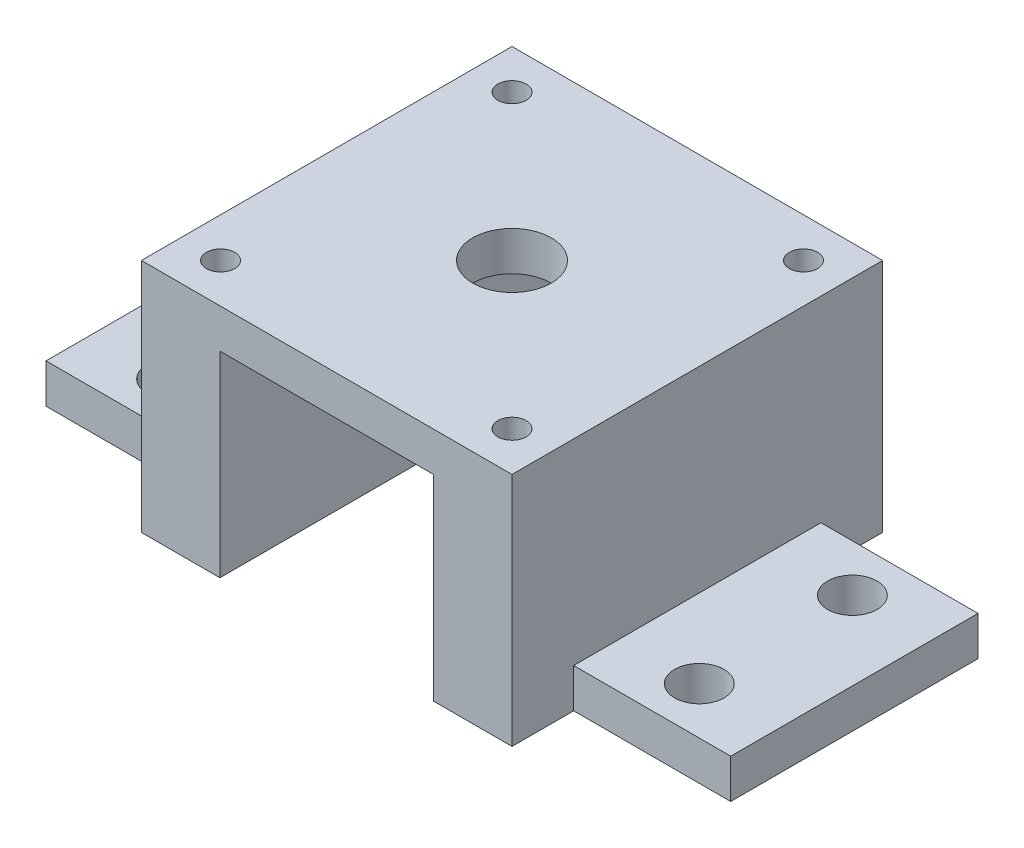
ISO-10303-21;
HEADER;
FILE_DESCRIPTION(('STEP AP214'),'2;1');
FILE_NAME('part.step','',(''),(''),'','','');
FILE_SCHEMA(('AUTOMOTIVE_DESIGN { 1 0 10303 214 1 1 1 1 }'));
ENDSEC;
DATA;
#1=APPLICATION_CONTEXT('core data for automotive mechanical design processes');
#2=APPLICATION_PROTOCOL_DEFINITION('international standard','automotive_design',2000,#1);
#3=PRODUCT_CONTEXT('',#1,'mechanical');
#4=PRODUCT('Part','Part','',(#3));
#5=PRODUCT_RELATED_PRODUCT_CATEGORY('part','',(#4));
#6=PRODUCT_DEFINITION_FORMATION('','',#4);
#7=PRODUCT_DEFINITION_CONTEXT('part definition',#1,'design');
#8=PRODUCT_DEFINITION('design','',#6,#7);
#9=PRODUCT_DEFINITION_SHAPE('','',#8);
#10=(LENGTH_UNIT() NAMED_UNIT(*) SI_UNIT(.MILLI.,.METRE.));
#11=(NAMED_UNIT(*) PLANE_ANGLE_UNIT() SI_UNIT($,.RADIAN.));
#12=(NAMED_UNIT(*) SI_UNIT($,.STERADIAN.) SOLID_ANGLE_UNIT());
#13=UNCERTAINTY_MEASURE_WITH_UNIT(LENGTH_MEASURE(1.E-05),#10,'distance_accuracy_value','');
#14=(GEOMETRIC_REPRESENTATION_CONTEXT(3) GLOBAL_UNCERTAINTY_ASSIGNED_CONTEXT((#13)) GLOBAL_UNIT_ASSIGNED_CONTEXT((#10,
#11,#12)) REPRESENTATION_CONTEXT('',''));
#15=CARTESIAN_POINT('',(0.,0.,0.));
#16=DIRECTION('',(0.,0.,1.));
#17=DIRECTION('',(1.,0.,0.));
#18=AXIS2_PLACEMENT_3D('',#15,#16,#17);
#19=CARTESIAN_POINT('',(-59.944,38.1,-25.0118450704225));
#20=DIRECTION('',(1.,0.,0.));
#21=DIRECTION('',(0.,0.,-1.));
#22=AXIS2_PLACEMENT_3D('',#19,#20,#21);
#23=PLANE('',#22);
#24=DIRECTION('',(0.,-1.,0.));
#25=VECTOR('',#24,1.);
#26=CARTESIAN_POINT('',(-59.944,0.,-15.0398451924225));
#27=LINE('',#26,#25);
#28=CARTESIAN_POINT('',(-59.944,6.35,-15.0398451924225));
#29=VERTEX_POINT('',#28);
#30=CARTESIAN_POINT('',(-59.944,0.,-15.0398451924225));
#31=VERTEX_POINT('',#30);
#32=EDGE_CURVE('E65',#29,#31,#27,.T.);
#33=ORIENTED_EDGE('',*,*,#32,.F.);
#34=DIRECTION('',(0.,0.,-1.));
#35=VECTOR('',#34,1.);
#36=CARTESIAN_POINT('',(-59.944,6.35,-15.0398451924225));
#37=LINE('',#36,#35);
#38=CARTESIAN_POINT('',(-59.944,6.35,24.9601548075775));
#39=VERTEX_POINT('',#38);
#40=EDGE_CURVE('E181',#39,#29,#37,.T.);
#41=ORIENTED_EDGE('',*,*,#40,.F.);
#42=DIRECTION('',(0.,1.,0.));
#43=VECTOR('',#42,1.);
#44=CARTESIAN_POINT('',(-59.944,0.,24.9601548075775));
#45=LINE('',#44,#43);
#46=CARTESIAN_POINT('',(-59.944,0.,24.9601548075775));
#47=VERTEX_POINT('',#46);
#48=EDGE_CURVE('E68',#47,#39,#45,.T.);
#49=ORIENTED_EDGE('',*,*,#48,.F.);
#50=DIRECTION('',(0.,0.,1.));
#51=VECTOR('',#50,1.);
#52=CARTESIAN_POINT('',(-59.944,0.,-25.0118450704225));
#53=LINE('',#52,#51);
#54=CARTESIAN_POINT('',(-59.944,0.,34.9321549295775));
#55=VERTEX_POINT('',#54);
#56=EDGE_CURVE('E264',#47,#55,#53,.T.);
#57=ORIENTED_EDGE('',*,*,#56,.T.);
#58=DIRECTION('',(0.,-1.,0.));
#59=VECTOR('',#58,1.);
#60=CARTESIAN_POINT('',(-59.944,38.1,34.9321549295775));
#61=LINE('',#60,#59);
#62=CARTESIAN_POINT('',(-59.944,38.1,34.9321549295775));
#63=VERTEX_POINT('',#62);
#64=EDGE_CURVE('E11',#63,#55,#61,.T.);
#65=ORIENTED_EDGE('',*,*,#64,.F.);
#66=DIRECTION('',(0.,0.,1.));
#67=VECTOR('',#66,1.);
#68=CARTESIAN_POINT('',(-59.944,38.1,-25.0118450704225));
#69=LINE('',#68,#67);
#70=CARTESIAN_POINT('',(-59.944,38.1,-25.0118450704225));
#71=VERTEX_POINT('',#70);
#72=EDGE_CURVE('E274',#71,#63,#69,.T.);
#73=ORIENTED_EDGE('',*,*,#72,.F.);
#74=DIRECTION('',(0.,-1.,0.));
#75=VECTOR('',#74,1.);
#76=CARTESIAN_POINT('',(-59.944,38.1,-25.0118450704225));
#77=LINE('',#76,#75);
#78=CARTESIAN_POINT('',(-59.944,0.,-25.0118450704225));
#79=VERTEX_POINT('',#78);
#80=EDGE_CURVE('E292',#71,#79,#77,.T.);
#81=ORIENTED_EDGE('',*,*,#80,.T.);
#82=EDGE_CURVE('E295',#79,#31,#53,.T.);
#83=ORIENTED_EDGE('',*,*,#82,.T.);
#84=EDGE_LOOP('',(#33,#41,#49,#57,#65,#73,#81,#83));
#85=FACE_BOUND('',#84,.T.);
#86=ADVANCED_FACE('F50',(#85),#23,.F.);
#87=CARTESIAN_POINT('',(0.,0.,0.));
#88=DIRECTION('',(0.,1.,0.));
#89=DIRECTION('',(0.,0.,1.));
#90=AXIS2_PLACEMENT_3D('',#87,#88,#89);
#91=PLANE('',#90);
#92=CARTESIAN_POINT('',(-72.644,0.,17.3401548075775));
#93=DIRECTION('',(0.,1.,0.));
#94=DIRECTION('',(0.,0.,1.));
#95=AXIS2_PLACEMENT_3D('',#92,#93,#94);
#96=CIRCLE('',#95,4.00000000000001);
#97=CARTESIAN_POINT('',(-72.644,0.,21.3401548075775));
#98=VERTEX_POINT('',#97);
#99=EDGE_CURVE('E412',#98,#98,#96,.T.);
#100=ORIENTED_EDGE('',*,*,#99,.T.);
#101=EDGE_LOOP('',(#100));
#102=FACE_BOUND('',#101,.T.);
#103=CARTESIAN_POINT('',(-72.644,0.,-7.41984519242252));
#104=DIRECTION('',(0.,1.,0.));
#105=DIRECTION('',(0.,0.,1.));
#106=AXIS2_PLACEMENT_3D('',#103,#104,#105);
#107=CIRCLE('',#106,4.00000000000001);
#108=CARTESIAN_POINT('',(-72.644,0.,-3.41984519242251));
#109=VERTEX_POINT('',#108);
#110=EDGE_CURVE('E423',#109,#109,#107,.T.);
#111=ORIENTED_EDGE('',*,*,#110,.T.);
#112=EDGE_LOOP('',(#111));
#113=FACE_BOUND('',#112,.T.);
#114=DIRECTION('',(1.,0.,0.));
#115=VECTOR('',#114,1.);
#116=CARTESIAN_POINT('',(-59.944,0.,-25.0118450704225));
#117=LINE('',#116,#115);
#118=CARTESIAN_POINT('',(-47.244,0.,-25.0118450704225));
#119=VERTEX_POINT('',#118);
#120=EDGE_CURVE('E278',#79,#119,#117,.T.);
#121=ORIENTED_EDGE('',*,*,#120,.T.);
#122=DIRECTION('',(0.,0.,1.));
#123=VECTOR('',#122,1.);
#124=CARTESIAN_POINT('',(-47.244,0.,-25.0118450704225));
#125=LINE('',#124,#123);
#126=CARTESIAN_POINT('',(-47.244,0.,34.9321549295775));
#127=VERTEX_POINT('',#126);
#128=EDGE_CURVE('E253',#119,#127,#125,.T.);
#129=ORIENTED_EDGE('',*,*,#128,.T.);
#130=DIRECTION('',(1.,0.,0.));
#131=VECTOR('',#130,1.);
#132=CARTESIAN_POINT('',(-59.944,0.,34.9321549295775));
#133=LINE('',#132,#131);
#134=EDGE_CURVE('E297',#55,#127,#133,.T.);
#135=ORIENTED_EDGE('',*,*,#134,.F.);
#136=ORIENTED_EDGE('',*,*,#56,.F.);
#137=DIRECTION('',(1.,0.,0.));
#138=VECTOR('',#137,1.);
#139=CARTESIAN_POINT('',(-85.344,0.,24.9601548075775));
#140=LINE('',#139,#138);
#141=CARTESIAN_POINT('',(-85.344,0.,24.9601548075775));
#142=VERTEX_POINT('',#141);
#143=EDGE_CURVE('E169',#142,#47,#140,.T.);
#144=ORIENTED_EDGE('',*,*,#143,.F.);
#145=DIRECTION('',(0.,0.,1.));
#146=VECTOR('',#145,1.);
#147=CARTESIAN_POINT('',(-85.344,0.,-15.0398451924225));
#148=LINE('',#147,#146);
#149=CARTESIAN_POINT('',(-85.344,0.,-15.0398451924225));
#150=VERTEX_POINT('',#149);
#151=EDGE_CURVE('E159',#150,#142,#148,.T.);
#152=ORIENTED_EDGE('',*,*,#151,.F.);
#153=DIRECTION('',(1.,0.,0.));
#154=VECTOR('',#153,1.);
#155=CARTESIAN_POINT('',(-85.344,0.,-15.0398451924225));
#156=LINE('',#155,#154);
#157=EDGE_CURVE('E167',#150,#31,#156,.T.);
#158=ORIENTED_EDGE('',*,*,#157,.T.);
#159=ORIENTED_EDGE('',*,*,#82,.F.);
#160=EDGE_LOOP('',(#121,#129,#135,#136,#144,#152,#158,#159));
#161=FACE_BOUND('',#160,.T.);
#162=ADVANCED_FACE('F162',(#102,#113,#161),#91,.F.);
#163=CARTESIAN_POINT('',(-59.944,38.1,34.9321549295775));
#164=DIRECTION('',(0.,0.,-1.));
#165=DIRECTION('',(-1.,0.,0.));
#166=AXIS2_PLACEMENT_3D('',#163,#164,#165);
#167=PLANE('',#166);
#168=ORIENTED_EDGE('',*,*,#134,.T.);
#169=DIRECTION('',(0.,-1.,0.));
#170=VECTOR('',#169,1.);
#171=CARTESIAN_POINT('',(-47.244,0.,34.9321549295775));
#172=LINE('',#171,#170);
#173=CARTESIAN_POINT('',(-47.244,31.75,34.9321549295775));
#174=VERTEX_POINT('',#173);
#175=EDGE_CURVE('E252',#174,#127,#172,.T.);
#176=ORIENTED_EDGE('',*,*,#175,.F.);
#177=DIRECTION('',(-1.,0.,0.));
#178=VECTOR('',#177,1.);
#179=CARTESIAN_POINT('',(-47.244,31.75,34.9321549295775));
#180=LINE('',#179,#178);
#181=CARTESIAN_POINT('',(-12.7,31.75,34.9321549295775));
#182=VERTEX_POINT('',#181);
#183=EDGE_CURVE('E245',#182,#174,#180,.T.);
#184=ORIENTED_EDGE('',*,*,#183,.F.);
#185=DIRECTION('',(0.,1.,0.));
#186=VECTOR('',#185,1.);
#187=CARTESIAN_POINT('',(-12.7,0.,34.9321549295775));
#188=LINE('',#187,#186);
#189=CARTESIAN_POINT('',(-12.7,0.,34.9321549295775));
#190=VERTEX_POINT('',#189);
#191=EDGE_CURVE('E254',#190,#182,#188,.T.);
#192=ORIENTED_EDGE('',*,*,#191,.F.);
#193=CARTESIAN_POINT('',(0.,0.,34.9321549295775));
#194=VERTEX_POINT('',#193);
#195=EDGE_CURVE('E293',#190,#194,#133,.T.);
#196=ORIENTED_EDGE('',*,*,#195,.T.);
#197=DIRECTION('',(0.,-1.,0.));
#198=VECTOR('',#197,1.);
#199=CARTESIAN_POINT('',(0.,38.1,34.9321549295775));
#200=LINE('',#199,#198);
#201=CARTESIAN_POINT('',(0.,38.1,34.9321549295775));
#202=VERTEX_POINT('',#201);
#203=EDGE_CURVE('E57',#202,#194,#200,.T.);
#204=ORIENTED_EDGE('',*,*,#203,.F.);
#205=DIRECTION('',(1.,0.,0.));
#206=VECTOR('',#205,1.);
#207=CARTESIAN_POINT('',(-59.944,38.1,34.9321549295775));
#208=LINE('',#207,#206);
#209=EDGE_CURVE('E276',#63,#202,#208,.T.);
#210=ORIENTED_EDGE('',*,*,#209,.F.);
#211=ORIENTED_EDGE('',*,*,#64,.T.);
#212=EDGE_LOOP('',(#168,#176,#184,#192,#196,#204,#210,#211));
#213=FACE_BOUND('',#212,.T.);
#214=ADVANCED_FACE('F325',(#213),#167,.F.);
#215=CARTESIAN_POINT('',(0.,38.1,-25.0118450704225));
#216=DIRECTION('',(1.,0.,0.));
#217=DIRECTION('',(0.,0.,-1.));
#218=AXIS2_PLACEMENT_3D('',#215,#216,#217);
#219=PLANE('',#218);
#220=DIRECTION('',(0.,-1.,0.));
#221=VECTOR('',#220,1.);
#222=CARTESIAN_POINT('',(0.,0.,24.9601548075775));
#223=LINE('',#222,#221);
#224=CARTESIAN_POINT('',(0.,6.35,24.9601548075775));
#225=VERTEX_POINT('',#224);
#226=CARTESIAN_POINT('',(0.,0.,24.9601548075775));
#227=VERTEX_POINT('',#226);
#228=EDGE_CURVE('E189',#225,#227,#223,.T.);
#229=ORIENTED_EDGE('',*,*,#228,.F.);
#230=DIRECTION('',(0.,0.,1.));
#231=VECTOR('',#230,1.);
#232=CARTESIAN_POINT('',(0.,6.35,24.9601548075775));
#233=LINE('',#232,#231);
#234=CARTESIAN_POINT('',(0.,6.35,-15.0398451924225));
#235=VERTEX_POINT('',#234);
#236=EDGE_CURVE('E201',#235,#225,#233,.T.);
#237=ORIENTED_EDGE('',*,*,#236,.F.);
#238=DIRECTION('',(0.,1.,0.));
#239=VECTOR('',#238,1.);
#240=CARTESIAN_POINT('',(0.,0.,-15.0398451924225));
#241=LINE('',#240,#239);
#242=CARTESIAN_POINT('',(0.,0.,-15.0398451924225));
#243=VERTEX_POINT('',#242);
#244=EDGE_CURVE('E192',#243,#235,#241,.T.);
#245=ORIENTED_EDGE('',*,*,#244,.F.);
#246=DIRECTION('',(0.,0.,1.));
#247=VECTOR('',#246,1.);
#248=CARTESIAN_POINT('',(0.,0.,-25.0118450704225));
#249=LINE('',#248,#247);
#250=CARTESIAN_POINT('',(0.,0.,-25.0118450704225));
#251=VERTEX_POINT('',#250);
#252=EDGE_CURVE('E301',#251,#243,#249,.T.);
#253=ORIENTED_EDGE('',*,*,#252,.F.);
#254=DIRECTION('',(0.,-1.,0.));
#255=VECTOR('',#254,1.);
#256=CARTESIAN_POINT('',(0.,38.1,-25.0118450704225));
#257=LINE('',#256,#255);
#258=CARTESIAN_POINT('',(0.,38.1,-25.0118450704225));
#259=VERTEX_POINT('',#258);
#260=EDGE_CURVE('E309',#259,#251,#257,.T.);
#261=ORIENTED_EDGE('',*,*,#260,.F.);
#262=DIRECTION('',(0.,0.,1.));
#263=VECTOR('',#262,1.);
#264=CARTESIAN_POINT('',(0.,38.1,-25.0118450704225));
#265=LINE('',#264,#263);
#266=EDGE_CURVE('E285',#259,#202,#265,.T.);
#267=ORIENTED_EDGE('',*,*,#266,.T.);
#268=ORIENTED_EDGE('',*,*,#203,.T.);
#269=EDGE_CURVE('E298',#227,#194,#249,.T.);
#270=ORIENTED_EDGE('',*,*,#269,.F.);
#271=EDGE_LOOP('',(#229,#237,#245,#253,#261,#267,#268,#270));
#272=FACE_BOUND('',#271,.T.);
#273=ADVANCED_FACE('F318',(#272),#219,.T.);
#274=CARTESIAN_POINT('',(-59.944,38.1,-25.0118450704225));
#275=DIRECTION('',(0.,0.,-1.));
#276=DIRECTION('',(-1.,0.,0.));
#277=AXIS2_PLACEMENT_3D('',#274,#275,#276);
#278=PLANE('',#277);
#279=DIRECTION('',(0.,-1.,0.));
#280=VECTOR('',#279,1.);
#281=CARTESIAN_POINT('',(-47.244,0.,-25.0118450704225));
#282=LINE('',#281,#280);
#283=CARTESIAN_POINT('',(-47.244,31.75,-25.0118450704225));
#284=VERTEX_POINT('',#283);
#285=EDGE_CURVE('E236',#284,#119,#282,.T.);
#286=ORIENTED_EDGE('',*,*,#285,.T.);
#287=ORIENTED_EDGE('',*,*,#120,.F.);
#288=ORIENTED_EDGE('',*,*,#80,.F.);
#289=DIRECTION('',(1.,0.,0.));
#290=VECTOR('',#289,1.);
#291=CARTESIAN_POINT('',(-59.944,38.1,-25.0118450704225));
#292=LINE('',#291,#290);
#293=EDGE_CURVE('E287',#71,#259,#292,.T.);
#294=ORIENTED_EDGE('',*,*,#293,.T.);
#295=ORIENTED_EDGE('',*,*,#260,.T.);
#296=CARTESIAN_POINT('',(-12.7,0.,-25.0118450704225));
#297=VERTEX_POINT('',#296);
#298=EDGE_CURVE('E305',#297,#251,#117,.T.);
#299=ORIENTED_EDGE('',*,*,#298,.F.);
#300=DIRECTION('',(0.,1.,0.));
#301=VECTOR('',#300,1.);
#302=CARTESIAN_POINT('',(-12.7,0.,-25.0118450704225));
#303=LINE('',#302,#301);
#304=CARTESIAN_POINT('',(-12.7,31.75,-25.0118450704225));
#305=VERTEX_POINT('',#304);
#306=EDGE_CURVE('E244',#297,#305,#303,.T.);
#307=ORIENTED_EDGE('',*,*,#306,.T.);
#308=DIRECTION('',(-1.,0.,0.));
#309=VECTOR('',#308,1.);
#310=CARTESIAN_POINT('',(-47.244,31.75,-25.0118450704225));
#311=LINE('',#310,#309);
#312=EDGE_CURVE('E247',#305,#284,#311,.T.);
#313=ORIENTED_EDGE('',*,*,#312,.T.);
#314=EDGE_LOOP('',(#286,#287,#288,#294,#295,#299,#307,#313));
#315=FACE_BOUND('',#314,.T.);
#316=ADVANCED_FACE('F383',(#315),#278,.T.);
#317=CARTESIAN_POINT('',(0.,38.1,0.));
#318=DIRECTION('',(0.,1.,0.));
#319=DIRECTION('',(0.,0.,1.));
#320=AXIS2_PLACEMENT_3D('',#317,#318,#319);
#321=PLANE('',#320);
#322=CARTESIAN_POINT('',(-6.4008,38.1,-18.6110450704225));
#323=DIRECTION('',(0.,1.,0.));
#324=DIRECTION('',(0.,0.,1.));
#325=AXIS2_PLACEMENT_3D('',#322,#323,#324);
#326=CIRCLE('',#325,2.286);
#327=CARTESIAN_POINT('',(-6.4008,38.1,-16.3250450704225));
#328=VERTEX_POINT('',#327);
#329=EDGE_CURVE('E702',#328,#328,#326,.T.);
#330=ORIENTED_EDGE('',*,*,#329,.F.);
#331=EDGE_LOOP('',(#330));
#332=FACE_BOUND('',#331,.T.);
#333=CARTESIAN_POINT('',(-53.5432,38.1,28.5313549295775));
#334=DIRECTION('',(0.,1.,0.));
#335=DIRECTION('',(0.,0.,1.));
#336=AXIS2_PLACEMENT_3D('',#333,#334,#335);
#337=CIRCLE('',#336,2.28599999999999);
#338=CARTESIAN_POINT('',(-53.5432,38.1,30.8173549295775));
#339=VERTEX_POINT('',#338);
#340=EDGE_CURVE('E721',#339,#339,#337,.T.);
#341=ORIENTED_EDGE('',*,*,#340,.F.);
#342=EDGE_LOOP('',(#341));
#343=FACE_BOUND('',#342,.T.);
#344=CARTESIAN_POINT('',(-6.4008,38.1,28.5313549295775));
#345=DIRECTION('',(0.,1.,0.));
#346=DIRECTION('',(0.,0.,1.));
#347=AXIS2_PLACEMENT_3D('',#344,#345,#346);
#348=CIRCLE('',#347,2.286);
#349=CARTESIAN_POINT('',(-6.4008,38.1,30.8173549295775));
#350=VERTEX_POINT('',#349);
#351=EDGE_CURVE('E712',#350,#350,#348,.T.);
#352=ORIENTED_EDGE('',*,*,#351,.F.);
#353=EDGE_LOOP('',(#352));
#354=FACE_BOUND('',#353,.T.);
#355=CARTESIAN_POINT('',(-53.5432,38.1,-18.6110450704225));
#356=DIRECTION('',(0.,1.,0.));
#357=DIRECTION('',(0.,0.,1.));
#358=AXIS2_PLACEMENT_3D('',#355,#356,#357);
#359=CIRCLE('',#358,2.28599999999999);
#360=CARTESIAN_POINT('',(-53.5432,38.1,-16.3250450704225));
#361=VERTEX_POINT('',#360);
#362=EDGE_CURVE('E401',#361,#361,#359,.T.);
#363=ORIENTED_EDGE('',*,*,#362,.F.);
#364=EDGE_LOOP('',(#363));
#365=FACE_BOUND('',#364,.T.);
#366=CARTESIAN_POINT('',(-29.972,38.1,4.96015492957747));
#367=DIRECTION('',(0.,1.,0.));
#368=DIRECTION('',(0.,0.,1.));
#369=AXIS2_PLACEMENT_3D('',#366,#367,#368);
#370=CIRCLE('',#369,6.35);
#371=CARTESIAN_POINT('',(-29.972,38.1,11.3101549295775));
#372=VERTEX_POINT('',#371);
#373=EDGE_CURVE('E233',#372,#372,#370,.T.);
#374=ORIENTED_EDGE('',*,*,#373,.F.);
#375=EDGE_LOOP('',(#374));
#376=FACE_BOUND('',#375,.T.);
#377=ORIENTED_EDGE('',*,*,#72,.T.);
#378=ORIENTED_EDGE('',*,*,#209,.T.);
#379=ORIENTED_EDGE('',*,*,#266,.F.);
#380=ORIENTED_EDGE('',*,*,#293,.F.);
#381=EDGE_LOOP('',(#377,#378,#379,#380));
#382=FACE_BOUND('',#381,.T.);
#383=ADVANCED_FACE('F374',(#332,#343,#354,#365,#376,#382),#321,.T.);
#384=CARTESIAN_POINT('',(12.7,0.,-7.41984519242253));
#385=DIRECTION('',(0.,1.,0.));
#386=DIRECTION('',(0.,0.,1.));
#387=AXIS2_PLACEMENT_3D('',#384,#385,#386);
#388=CIRCLE('',#387,4.);
#389=CARTESIAN_POINT('',(12.7,0.,-3.41984519242253));
#390=VERTEX_POINT('',#389);
#391=EDGE_CURVE('E386',#390,#390,#388,.T.);
#392=ORIENTED_EDGE('',*,*,#391,.T.);
#393=EDGE_LOOP('',(#392));
#394=FACE_BOUND('',#393,.T.);
#395=CARTESIAN_POINT('',(12.7,0.,17.3401548075775));
#396=DIRECTION('',(0.,1.,0.));
#397=DIRECTION('',(0.,0.,1.));
#398=AXIS2_PLACEMENT_3D('',#395,#396,#397);
#399=CIRCLE('',#398,4.);
#400=CARTESIAN_POINT('',(12.7,0.,21.3401548075775));
#401=VERTEX_POINT('',#400);
#402=EDGE_CURVE('E394',#401,#401,#399,.T.);
#403=ORIENTED_EDGE('',*,*,#402,.T.);
#404=EDGE_LOOP('',(#403));
#405=FACE_BOUND('',#404,.T.);
#406=ORIENTED_EDGE('',*,*,#195,.F.);
#407=DIRECTION('',(0.,0.,1.));
#408=VECTOR('',#407,1.);
#409=CARTESIAN_POINT('',(-12.7,0.,-25.0118450704225));
#410=LINE('',#409,#408);
#411=EDGE_CURVE('E267',#297,#190,#410,.T.);
#412=ORIENTED_EDGE('',*,*,#411,.F.);
#413=ORIENTED_EDGE('',*,*,#298,.T.);
#414=ORIENTED_EDGE('',*,*,#252,.T.);
#415=DIRECTION('',(-1.,0.,0.));
#416=VECTOR('',#415,1.);
#417=CARTESIAN_POINT('',(25.4,0.,-15.0398451924225));
#418=LINE('',#417,#416);
#419=CARTESIAN_POINT('',(25.4,0.,-15.0398451924225));
#420=VERTEX_POINT('',#419);
#421=EDGE_CURVE('E227',#420,#243,#418,.T.);
#422=ORIENTED_EDGE('',*,*,#421,.F.);
#423=DIRECTION('',(0.,0.,-1.));
#424=VECTOR('',#423,1.);
#425=CARTESIAN_POINT('',(25.4,0.,24.9601548075775));
#426=LINE('',#425,#424);
#427=CARTESIAN_POINT('',(25.4,0.,24.9601548075775));
#428=VERTEX_POINT('',#427);
#429=EDGE_CURVE('E205',#428,#420,#426,.T.);
#430=ORIENTED_EDGE('',*,*,#429,.F.);
#431=DIRECTION('',(-1.,0.,0.));
#432=VECTOR('',#431,1.);
#433=CARTESIAN_POINT('',(25.4,0.,24.9601548075775));
#434=LINE('',#433,#432);
#435=EDGE_CURVE('E228',#428,#227,#434,.T.);
#436=ORIENTED_EDGE('',*,*,#435,.T.);
#437=ORIENTED_EDGE('',*,*,#269,.T.);
#438=EDGE_LOOP('',(#406,#412,#413,#414,#422,#430,#436,#437));
#439=FACE_BOUND('',#438,.T.);
#440=ADVANCED_FACE('F365',(#394,#405,#439),#91,.F.);
#441=CARTESIAN_POINT('',(-47.244,0.,-25.0118450704225));
#442=DIRECTION('',(-1.,0.,0.));
#443=DIRECTION('',(0.,0.,1.));
#444=AXIS2_PLACEMENT_3D('',#441,#442,#443);
#445=PLANE('',#444);
#446=ORIENTED_EDGE('',*,*,#175,.T.);
#447=ORIENTED_EDGE('',*,*,#128,.F.);
#448=ORIENTED_EDGE('',*,*,#285,.F.);
#449=DIRECTION('',(0.,0.,1.));
#450=VECTOR('',#449,1.);
#451=CARTESIAN_POINT('',(-47.244,31.75,-25.0118450704225));
#452=LINE('',#451,#450);
#453=EDGE_CURVE('E265',#284,#174,#452,.T.);
#454=ORIENTED_EDGE('',*,*,#453,.T.);
#455=EDGE_LOOP('',(#446,#447,#448,#454));
#456=FACE_BOUND('',#455,.T.);
#457=ADVANCED_FACE('F372',(#456),#445,.F.);
#458=CARTESIAN_POINT('',(-47.244,31.75,-25.0118450704225));
#459=DIRECTION('',(0.,1.,0.));
#460=DIRECTION('',(0.,0.,1.));
#461=AXIS2_PLACEMENT_3D('',#458,#459,#460);
#462=PLANE('',#461);
#463=CARTESIAN_POINT('',(-29.972,31.75,4.96015492957747));
#464=DIRECTION('',(0.,1.,0.));
#465=DIRECTION('',(0.,0.,1.));
#466=AXIS2_PLACEMENT_3D('',#463,#464,#465);
#467=CIRCLE('',#466,6.35);
#468=CARTESIAN_POINT('',(-29.972,31.75,11.3101549295775));
#469=VERTEX_POINT('',#468);
#470=EDGE_CURVE('E49',#469,#469,#467,.T.);
#471=ORIENTED_EDGE('',*,*,#470,.T.);
#472=EDGE_LOOP('',(#471));
#473=FACE_BOUND('',#472,.T.);
#474=ORIENTED_EDGE('',*,*,#183,.T.);
#475=ORIENTED_EDGE('',*,*,#453,.F.);
#476=ORIENTED_EDGE('',*,*,#312,.F.);
#477=DIRECTION('',(0.,0.,1.));
#478=VECTOR('',#477,1.);
#479=CARTESIAN_POINT('',(-12.7,31.75,-25.0118450704225));
#480=LINE('',#479,#478);
#481=EDGE_CURVE('E266',#305,#182,#480,.T.);
#482=ORIENTED_EDGE('',*,*,#481,.T.);
#483=EDGE_LOOP('',(#474,#475,#476,#482));
#484=FACE_BOUND('',#483,.T.);
#485=ADVANCED_FACE('F333',(#473,#484),#462,.F.);
#486=CARTESIAN_POINT('',(-12.7,0.,-25.0118450704225));
#487=DIRECTION('',(1.,0.,0.));
#488=DIRECTION('',(0.,0.,-1.));
#489=AXIS2_PLACEMENT_3D('',#486,#487,#488);
#490=PLANE('',#489);
#491=ORIENTED_EDGE('',*,*,#191,.T.);
#492=ORIENTED_EDGE('',*,*,#481,.F.);
#493=ORIENTED_EDGE('',*,*,#306,.F.);
#494=ORIENTED_EDGE('',*,*,#411,.T.);
#495=EDGE_LOOP('',(#491,#492,#493,#494));
#496=FACE_BOUND('',#495,.T.);
#497=ADVANCED_FACE('F341',(#496),#490,.F.);
#498=CARTESIAN_POINT('',(-29.972,0.,4.96015492957747));
#499=DIRECTION('',(0.,1.,0.));
#500=DIRECTION('',(0.,0.,1.));
#501=AXIS2_PLACEMENT_3D('',#498,#499,#500);
#502=CYLINDRICAL_SURFACE('',#501,6.35);
#503=CARTESIAN_POINT('',(-29.972,38.1,11.3101549295775));
#504=CARTESIAN_POINT('',(-29.972,38.0338541666667,11.3101549295775));
#505=CARTESIAN_POINT('',(-29.972,37.9677083333333,11.3101549295775));
#506=CARTESIAN_POINT('',(-29.972,37.8354166666667,11.3101549295775));
#507=CARTESIAN_POINT('',(-29.972,37.7692708333333,11.3101549295775));
#508=CARTESIAN_POINT('',(-29.972,37.6369791666667,11.3101549295775));
#509=CARTESIAN_POINT('',(-29.972,37.5708333333333,11.3101549295775));
#510=CARTESIAN_POINT('',(-29.972,37.4385416666667,11.3101549295775));
#511=CARTESIAN_POINT('',(-29.972,37.3723958333333,11.3101549295775));
#512=CARTESIAN_POINT('',(-29.972,37.2401041666667,11.3101549295775));
#513=CARTESIAN_POINT('',(-29.972,37.1739583333333,11.3101549295775));
#514=CARTESIAN_POINT('',(-29.972,37.0416666666667,11.3101549295775));
#515=CARTESIAN_POINT('',(-29.972,36.9755208333333,11.3101549295775));
#516=CARTESIAN_POINT('',(-29.972,36.8432291666667,11.3101549295775));
#517=CARTESIAN_POINT('',(-29.972,36.7770833333333,11.3101549295775));
#518=CARTESIAN_POINT('',(-29.972,36.6447916666667,11.3101549295775));
#519=CARTESIAN_POINT('',(-29.972,36.5786458333333,11.3101549295775));
#520=CARTESIAN_POINT('',(-29.972,36.4463541666667,11.3101549295775));
#521=CARTESIAN_POINT('',(-29.972,36.3802083333333,11.3101549295775));
#522=CARTESIAN_POINT('',(-29.972,36.2479166666667,11.3101549295775));
#523=CARTESIAN_POINT('',(-29.972,36.1817708333333,11.3101549295775));
#524=CARTESIAN_POINT('',(-29.972,36.0494791666667,11.3101549295775));
#525=CARTESIAN_POINT('',(-29.972,35.9833333333333,11.3101549295775));
#526=CARTESIAN_POINT('',(-29.972,35.8510416666667,11.3101549295775));
#527=CARTESIAN_POINT('',(-29.972,35.7848958333333,11.3101549295775));
#528=CARTESIAN_POINT('',(-29.972,35.6526041666667,11.3101549295775));
#529=CARTESIAN_POINT('',(-29.972,35.5864583333333,11.3101549295775));
#530=CARTESIAN_POINT('',(-29.972,35.4541666666667,11.3101549295775));
#531=CARTESIAN_POINT('',(-29.972,35.3880208333333,11.3101549295775));
#532=CARTESIAN_POINT('',(-29.972,35.2557291666667,11.3101549295775));
#533=CARTESIAN_POINT('',(-29.972,35.1895833333333,11.3101549295775));
#534=CARTESIAN_POINT('',(-29.972,35.0572916666667,11.3101549295775));
#535=CARTESIAN_POINT('',(-29.972,34.9911458333333,11.3101549295775));
#536=CARTESIAN_POINT('',(-29.972,34.8588541666667,11.3101549295775));
#537=CARTESIAN_POINT('',(-29.972,34.7927083333333,11.3101549295775));
#538=CARTESIAN_POINT('',(-29.972,34.6604166666667,11.3101549295775));
#539=CARTESIAN_POINT('',(-29.972,34.5942708333333,11.3101549295775));
#540=CARTESIAN_POINT('',(-29.972,34.4619791666667,11.3101549295775));
#541=CARTESIAN_POINT('',(-29.972,34.3958333333333,11.3101549295775));
#542=CARTESIAN_POINT('',(-29.972,34.2635416666667,11.3101549295775));
#543=CARTESIAN_POINT('',(-29.972,34.1973958333333,11.3101549295775));
#544=CARTESIAN_POINT('',(-29.972,34.0651041666667,11.3101549295775));
#545=CARTESIAN_POINT('',(-29.972,33.9989583333333,11.3101549295775));
#546=CARTESIAN_POINT('',(-29.972,33.8666666666667,11.3101549295775));
#547=CARTESIAN_POINT('',(-29.972,33.8005208333333,11.3101549295775));
#548=CARTESIAN_POINT('',(-29.972,33.6682291666667,11.3101549295775));
#549=CARTESIAN_POINT('',(-29.972,33.6020833333333,11.3101549295775));
#550=CARTESIAN_POINT('',(-29.972,33.4697916666667,11.3101549295775));
#551=CARTESIAN_POINT('',(-29.972,33.4036458333333,11.3101549295775));
#552=CARTESIAN_POINT('',(-29.972,33.2713541666667,11.3101549295775));
#553=CARTESIAN_POINT('',(-29.972,33.2052083333333,11.3101549295775));
#554=CARTESIAN_POINT('',(-29.972,33.0729166666667,11.3101549295775));
#555=CARTESIAN_POINT('',(-29.972,33.0067708333333,11.3101549295775));
#556=CARTESIAN_POINT('',(-29.972,32.8744791666667,11.3101549295775));
#557=CARTESIAN_POINT('',(-29.972,32.8083333333333,11.3101549295775));
#558=CARTESIAN_POINT('',(-29.972,32.6760416666667,11.3101549295775));
#559=CARTESIAN_POINT('',(-29.972,32.6098958333333,11.3101549295775));
#560=CARTESIAN_POINT('',(-29.972,32.4776041666667,11.3101549295775));
#561=CARTESIAN_POINT('',(-29.972,32.4114583333333,11.3101549295775));
#562=CARTESIAN_POINT('',(-29.972,32.2791666666667,11.3101549295775));
#563=CARTESIAN_POINT('',(-29.972,32.2130208333333,11.3101549295775));
#564=CARTESIAN_POINT('',(-29.972,32.0807291666667,11.3101549295775));
#565=CARTESIAN_POINT('',(-29.972,32.0145833333333,11.3101549295775));
#566=CARTESIAN_POINT('',(-29.972,31.8822916666667,11.3101549295775));
#567=CARTESIAN_POINT('',(-29.972,31.8161458333333,11.3101549295775));
#568=CARTESIAN_POINT('',(-29.972,31.75,11.3101549295775));
#569=B_SPLINE_CURVE_WITH_KNOTS('',3,(#503,#504,#505,#506,#507,#508,#509,#510,#511,#512,#513,
#514,#515,#516,#517,#518,#519,#520,#521,#522,#523,#524,#525,#526,#527,#528,#529,#530,#531,#532,
#533,#534,#535,#536,#537,#538,#539,#540,#541,#542,#543,#544,#545,#546,#547,#548,#549,#550,#551,
#552,#553,#554,#555,#556,#557,#558,#559,#560,#561,#562,#563,#564,#565,#566,#567,#568),
.UNSPECIFIED.,.F.,.F.,(4,2,2,2,2,2,2,2,2,2,2,2,2,2,2,2,2,2,2,2,2,2,2,2,2,2,2,2,2,2,2,2,4),(0.,
0.198437500000002,0.396874999999998,0.5953125,0.793750000000003,0.992187499999998,1.190625,
1.3890625,1.58750000000001,1.7859375,1.984375,2.18281250000001,2.38125,2.5796875,
2.77812500000001,2.9765625,3.175,3.37343750000001,3.571875,3.7703125,3.96875000000001,4.1671875,
4.365625,4.56406250000001,4.7625,4.96093750000001,5.15937500000001,5.3578125,5.55625000000001,
5.75468750000001,5.95312500000001,6.15156250000001,6.35000000000001),.UNSPECIFIED.);
#570=EDGE_CURVE('BSEAM340',#372,#469,#569,.T.);
#571=ORIENTED_EDGE('',*,*,#373,.T.);
#572=ORIENTED_EDGE('',*,*,#470,.F.);
#573=ORIENTED_EDGE('',*,*,#570,.T.);
#574=ORIENTED_EDGE('',*,*,#570,.F.);
#575=EDGE_LOOP('',(#571,#573,#572,#574));
#576=FACE_BOUND('',#575,.T.);
#577=ADVANCED_FACE('F340',(#576),#502,.F.);
#578=CARTESIAN_POINT('',(25.4,0.,24.9601548075775));
#579=DIRECTION('',(0.,0.,-1.));
#580=DIRECTION('',(0.,1.,0.));
#581=AXIS2_PLACEMENT_3D('',#578,#579,#580);
#582=PLANE('',#581);
#583=ORIENTED_EDGE('',*,*,#228,.T.);
#584=ORIENTED_EDGE('',*,*,#435,.F.);
#585=DIRECTION('',(0.,-1.,0.));
#586=VECTOR('',#585,1.);
#587=CARTESIAN_POINT('',(25.4,0.,24.9601548075775));
#588=LINE('',#587,#586);
#589=CARTESIAN_POINT('',(25.4,6.35,24.9601548075775));
#590=VERTEX_POINT('',#589);
#591=EDGE_CURVE('E196',#590,#428,#588,.T.);
#592=ORIENTED_EDGE('',*,*,#591,.F.);
#593=DIRECTION('',(-1.,0.,0.));
#594=VECTOR('',#593,1.);
#595=CARTESIAN_POINT('',(25.4,6.35,24.9601548075775));
#596=LINE('',#595,#594);
#597=EDGE_CURVE('E211',#590,#225,#596,.T.);
#598=ORIENTED_EDGE('',*,*,#597,.T.);
#599=EDGE_LOOP('',(#583,#584,#592,#598));
#600=FACE_BOUND('',#599,.T.);
#601=ADVANCED_FACE('F338',(#600),#582,.F.);
#602=CARTESIAN_POINT('',(25.4,0.,-15.0398451924225));
#603=DIRECTION('',(0.,0.,1.));
#604=DIRECTION('',(0.,-1.,0.));
#605=AXIS2_PLACEMENT_3D('',#602,#603,#604);
#606=PLANE('',#605);
#607=ORIENTED_EDGE('',*,*,#244,.T.);
#608=DIRECTION('',(-1.,0.,0.));
#609=VECTOR('',#608,1.);
#610=CARTESIAN_POINT('',(25.4,6.35,-15.0398451924225));
#611=LINE('',#610,#609);
#612=CARTESIAN_POINT('',(25.4,6.35,-15.0398451924225));
#613=VERTEX_POINT('',#612);
#614=EDGE_CURVE('E225',#613,#235,#611,.T.);
#615=ORIENTED_EDGE('',*,*,#614,.F.);
#616=DIRECTION('',(0.,1.,0.));
#617=VECTOR('',#616,1.);
#618=CARTESIAN_POINT('',(25.4,0.,-15.0398451924225));
#619=LINE('',#618,#617);
#620=EDGE_CURVE('E206',#420,#613,#619,.T.);
#621=ORIENTED_EDGE('',*,*,#620,.F.);
#622=ORIENTED_EDGE('',*,*,#421,.T.);
#623=EDGE_LOOP('',(#607,#615,#621,#622));
#624=FACE_BOUND('',#623,.T.);
#625=ADVANCED_FACE('F349',(#624),#606,.F.);
#626=CARTESIAN_POINT('',(25.4,6.35,24.9601548075775));
#627=DIRECTION('',(0.,-1.,0.));
#628=DIRECTION('',(0.,0.,-1.));
#629=AXIS2_PLACEMENT_3D('',#626,#627,#628);
#630=PLANE('',#629);
#631=CARTESIAN_POINT('',(12.7,6.35,-7.41984519242253));
#632=DIRECTION('',(0.,1.,0.));
#633=DIRECTION('',(0.,0.,1.));
#634=AXIS2_PLACEMENT_3D('',#631,#632,#633);
#635=CIRCLE('',#634,4.);
#636=CARTESIAN_POINT('',(12.7,6.35,-3.41984519242253));
#637=VERTEX_POINT('',#636);
#638=EDGE_CURVE('E415',#637,#637,#635,.T.);
#639=ORIENTED_EDGE('',*,*,#638,.F.);
#640=EDGE_LOOP('',(#639));
#641=FACE_BOUND('',#640,.T.);
#642=CARTESIAN_POINT('',(12.7,6.35,17.3401548075775));
#643=DIRECTION('',(0.,1.,0.));
#644=DIRECTION('',(0.,0.,1.));
#645=AXIS2_PLACEMENT_3D('',#642,#643,#644);
#646=CIRCLE('',#645,4.);
#647=CARTESIAN_POINT('',(12.7,6.35,21.3401548075775));
#648=VERTEX_POINT('',#647);
#649=EDGE_CURVE('E393',#648,#648,#646,.T.);
#650=ORIENTED_EDGE('',*,*,#649,.F.);
#651=EDGE_LOOP('',(#650));
#652=FACE_BOUND('',#651,.T.);
#653=ORIENTED_EDGE('',*,*,#236,.T.);
#654=ORIENTED_EDGE('',*,*,#597,.F.);
#655=DIRECTION('',(0.,0.,1.));
#656=VECTOR('',#655,1.);
#657=CARTESIAN_POINT('',(25.4,6.35,24.9601548075775));
#658=LINE('',#657,#656);
#659=EDGE_CURVE('E207',#613,#590,#658,.T.);
#660=ORIENTED_EDGE('',*,*,#659,.F.);
#661=ORIENTED_EDGE('',*,*,#614,.T.);
#662=EDGE_LOOP('',(#653,#654,#660,#661));
#663=FACE_BOUND('',#662,.T.);
#664=ADVANCED_FACE('F459',(#641,#652,#663),#630,.F.);
#665=CARTESIAN_POINT('',(25.4,0.,0.));
#666=DIRECTION('',(-1.,0.,0.));
#667=DIRECTION('',(0.,0.,1.));
#668=AXIS2_PLACEMENT_3D('',#665,#666,#667);
#669=PLANE('',#668);
#670=ORIENTED_EDGE('',*,*,#591,.T.);
#671=ORIENTED_EDGE('',*,*,#429,.T.);
#672=ORIENTED_EDGE('',*,*,#620,.T.);
#673=ORIENTED_EDGE('',*,*,#659,.T.);
#674=EDGE_LOOP('',(#670,#671,#672,#673));
#675=FACE_BOUND('',#674,.T.);
#676=ADVANCED_FACE('F453',(#675),#669,.F.);
#677=CARTESIAN_POINT('',(-85.344,0.,-15.0398451924225));
#678=DIRECTION('',(0.,0.,1.));
#679=DIRECTION('',(1.,0.,0.));
#680=AXIS2_PLACEMENT_3D('',#677,#678,#679);
#681=PLANE('',#680);
#682=ORIENTED_EDGE('',*,*,#32,.T.);
#683=ORIENTED_EDGE('',*,*,#157,.F.);
#684=DIRECTION('',(0.,-1.,0.));
#685=VECTOR('',#684,1.);
#686=CARTESIAN_POINT('',(-85.344,0.,-15.0398451924225));
#687=LINE('',#686,#685);
#688=CARTESIAN_POINT('',(-85.344,6.35,-15.0398451924225));
#689=VERTEX_POINT('',#688);
#690=EDGE_CURVE('E175',#689,#150,#687,.T.);
#691=ORIENTED_EDGE('',*,*,#690,.F.);
#692=DIRECTION('',(1.,0.,0.));
#693=VECTOR('',#692,1.);
#694=CARTESIAN_POINT('',(-85.344,6.35,-15.0398451924225));
#695=LINE('',#694,#693);
#696=EDGE_CURVE('E435',#689,#29,#695,.T.);
#697=ORIENTED_EDGE('',*,*,#696,.T.);
#698=EDGE_LOOP('',(#682,#683,#691,#697));
#699=FACE_BOUND('',#698,.T.);
#700=ADVANCED_FACE('F183',(#699),#681,.F.);
#701=CARTESIAN_POINT('',(-85.344,0.,24.9601548075775));
#702=DIRECTION('',(0.,0.,-1.));
#703=DIRECTION('',(-1.,0.,0.));
#704=AXIS2_PLACEMENT_3D('',#701,#702,#703);
#705=PLANE('',#704);
#706=ORIENTED_EDGE('',*,*,#48,.T.);
#707=DIRECTION('',(1.,0.,0.));
#708=VECTOR('',#707,1.);
#709=CARTESIAN_POINT('',(-85.344,6.35,24.9601548075775));
#710=LINE('',#709,#708);
#711=CARTESIAN_POINT('',(-85.344,6.35,24.9601548075775));
#712=VERTEX_POINT('',#711);
#713=EDGE_CURVE('E193',#712,#39,#710,.T.);
#714=ORIENTED_EDGE('',*,*,#713,.F.);
#715=DIRECTION('',(0.,1.,0.));
#716=VECTOR('',#715,1.);
#717=CARTESIAN_POINT('',(-85.344,0.,24.9601548075775));
#718=LINE('',#717,#716);
#719=EDGE_CURVE('E174',#142,#712,#718,.T.);
#720=ORIENTED_EDGE('',*,*,#719,.F.);
#721=ORIENTED_EDGE('',*,*,#143,.T.);
#722=EDGE_LOOP('',(#706,#714,#720,#721));
#723=FACE_BOUND('',#722,.T.);
#724=ADVANCED_FACE('F447',(#723),#705,.F.);
#725=CARTESIAN_POINT('',(-85.344,6.35,-15.0398451924225));
#726=DIRECTION('',(0.,-1.,0.));
#727=DIRECTION('',(0.,0.,-1.));
#728=AXIS2_PLACEMENT_3D('',#725,#726,#727);
#729=PLANE('',#728);
#730=CARTESIAN_POINT('',(-72.644,6.35,17.3401548075775));
#731=DIRECTION('',(0.,1.,0.));
#732=DIRECTION('',(0.,0.,1.));
#733=AXIS2_PLACEMENT_3D('',#730,#731,#732);
#734=CIRCLE('',#733,4.00000000000001);
#735=CARTESIAN_POINT('',(-72.644,6.35,21.3401548075775));
#736=VERTEX_POINT('',#735);
#737=EDGE_CURVE('E409',#736,#736,#734,.T.);
#738=ORIENTED_EDGE('',*,*,#737,.F.);
#739=EDGE_LOOP('',(#738));
#740=FACE_BOUND('',#739,.T.);
#741=CARTESIAN_POINT('',(-72.644,6.35,-7.41984519242252));
#742=DIRECTION('',(0.,1.,0.));
#743=DIRECTION('',(0.,0.,1.));
#744=AXIS2_PLACEMENT_3D('',#741,#742,#743);
#745=CIRCLE('',#744,4.00000000000001);
#746=CARTESIAN_POINT('',(-72.644,6.35,-3.41984519242251));
#747=VERTEX_POINT('',#746);
#748=EDGE_CURVE('E411',#747,#747,#745,.T.);
#749=ORIENTED_EDGE('',*,*,#748,.F.);
#750=EDGE_LOOP('',(#749));
#751=FACE_BOUND('',#750,.T.);
#752=ORIENTED_EDGE('',*,*,#40,.T.);
#753=ORIENTED_EDGE('',*,*,#696,.F.);
#754=DIRECTION('',(0.,0.,-1.));
#755=VECTOR('',#754,1.);
#756=CARTESIAN_POINT('',(-85.344,6.35,-15.0398451924225));
#757=LINE('',#756,#755);
#758=EDGE_CURVE('E179',#712,#689,#757,.T.);
#759=ORIENTED_EDGE('',*,*,#758,.F.);
#760=ORIENTED_EDGE('',*,*,#713,.T.);
#761=EDGE_LOOP('',(#752,#753,#759,#760));
#762=FACE_BOUND('',#761,.T.);
#763=ADVANCED_FACE('F441',(#740,#751,#762),#729,.F.);
#764=CARTESIAN_POINT('',(-85.344,0.,0.));
#765=DIRECTION('',(1.,0.,0.));
#766=DIRECTION('',(0.,0.,-1.));
#767=AXIS2_PLACEMENT_3D('',#764,#765,#766);
#768=PLANE('',#767);
#769=ORIENTED_EDGE('',*,*,#690,.T.);
#770=ORIENTED_EDGE('',*,*,#151,.T.);
#771=ORIENTED_EDGE('',*,*,#719,.T.);
#772=ORIENTED_EDGE('',*,*,#758,.T.);
#773=EDGE_LOOP('',(#769,#770,#771,#772));
#774=FACE_BOUND('',#773,.T.);
#775=ADVANCED_FACE('F176',(#774),#768,.F.);
#776=CARTESIAN_POINT('',(-72.644,0.,-7.41984519242252));
#777=DIRECTION('',(0.,1.,0.));
#778=DIRECTION('',(0.,0.,1.));
#779=AXIS2_PLACEMENT_3D('',#776,#777,#778);
#780=CYLINDRICAL_SURFACE('',#779,4.00000000000001);
#781=ORIENTED_EDGE('',*,*,#110,.F.);
#782=EDGE_LOOP('',(#781));
#783=FACE_BOUND('',#782,.T.);
#784=ORIENTED_EDGE('',*,*,#748,.T.);
#785=EDGE_LOOP('',(#784));
#786=FACE_BOUND('',#785,.T.);
#787=ADVANCED_FACE('F583',(#783,#786),#780,.F.);
#788=CARTESIAN_POINT('',(-72.644,0.,17.3401548075775));
#789=DIRECTION('',(0.,1.,0.));
#790=DIRECTION('',(0.,0.,1.));
#791=AXIS2_PLACEMENT_3D('',#788,#789,#790);
#792=CYLINDRICAL_SURFACE('',#791,4.00000000000001);
#793=ORIENTED_EDGE('',*,*,#99,.F.);
#794=EDGE_LOOP('',(#793));
#795=FACE_BOUND('',#794,.T.);
#796=ORIENTED_EDGE('',*,*,#737,.T.);
#797=EDGE_LOOP('',(#796));
#798=FACE_BOUND('',#797,.T.);
#799=ADVANCED_FACE('F586',(#795,#798),#792,.F.);
#800=CARTESIAN_POINT('',(12.7,0.,17.3401548075775));
#801=DIRECTION('',(0.,1.,0.));
#802=DIRECTION('',(0.,0.,1.));
#803=AXIS2_PLACEMENT_3D('',#800,#801,#802);
#804=CYLINDRICAL_SURFACE('',#803,4.);
#805=ORIENTED_EDGE('',*,*,#402,.F.);
#806=EDGE_LOOP('',(#805));
#807=FACE_BOUND('',#806,.T.);
#808=ORIENTED_EDGE('',*,*,#649,.T.);
#809=EDGE_LOOP('',(#808));
#810=FACE_BOUND('',#809,.T.);
#811=ADVANCED_FACE('F598',(#807,#810),#804,.F.);
#812=CARTESIAN_POINT('',(12.7,0.,-7.41984519242253));
#813=DIRECTION('',(0.,1.,0.));
#814=DIRECTION('',(0.,0.,1.));
#815=AXIS2_PLACEMENT_3D('',#812,#813,#814);
#816=CYLINDRICAL_SURFACE('',#815,4.);
#817=ORIENTED_EDGE('',*,*,#391,.F.);
#818=EDGE_LOOP('',(#817));
#819=FACE_BOUND('',#818,.T.);
#820=ORIENTED_EDGE('',*,*,#638,.T.);
#821=EDGE_LOOP('',(#820));
#822=FACE_BOUND('',#821,.T.);
#823=ADVANCED_FACE('F609',(#819,#822),#816,.F.);
#824=CARTESIAN_POINT('',(-53.5432,25.4,-18.6110450704225));
#825=DIRECTION('',(0.,1.,0.));
#826=DIRECTION('',(0.,0.,1.));
#827=AXIS2_PLACEMENT_3D('',#824,#825,#826);
#828=CYLINDRICAL_SURFACE('',#827,2.28599999999999);
#829=CARTESIAN_POINT('',(-53.5432,25.4,-18.6110450704225));
#830=DIRECTION('',(0.,1.,0.));
#831=DIRECTION('',(0.,0.,1.));
#832=AXIS2_PLACEMENT_3D('',#829,#830,#831);
#833=CIRCLE('',#832,2.28599999999999);
#834=CARTESIAN_POINT('',(-53.5432,25.4,-16.3250450704225));
#835=VERTEX_POINT('',#834);
#836=EDGE_CURVE('E396',#835,#835,#833,.T.);
#837=ORIENTED_EDGE('',*,*,#836,.F.);
#838=EDGE_LOOP('',(#837));
#839=FACE_BOUND('',#838,.T.);
#840=ORIENTED_EDGE('',*,*,#362,.T.);
#841=EDGE_LOOP('',(#840));
#842=FACE_BOUND('',#841,.T.);
#843=ADVANCED_FACE('F617',(#839,#842),#828,.F.);
#844=CARTESIAN_POINT('',(-53.5432,25.4,-18.6110450704225));
#845=DIRECTION('',(0.,1.,0.));
#846=DIRECTION('',(0.,0.,1.));
#847=AXIS2_PLACEMENT_3D('',#844,#845,#846);
#848=PLANE('',#847);
#849=ORIENTED_EDGE('',*,*,#836,.T.);
#850=EDGE_LOOP('',(#849));
#851=FACE_BOUND('',#850,.T.);
#852=ADVANCED_FACE('F629',(#851),#848,.T.);
#853=CARTESIAN_POINT('',(-6.4008,25.4,28.5313549295775));
#854=DIRECTION('',(0.,1.,0.));
#855=DIRECTION('',(0.,0.,1.));
#856=AXIS2_PLACEMENT_3D('',#853,#854,#855);
#857=CYLINDRICAL_SURFACE('',#856,2.286);
#858=CARTESIAN_POINT('',(-6.4008,25.4,28.5313549295775));
#859=DIRECTION('',(0.,1.,0.));
#860=DIRECTION('',(0.,0.,1.));
#861=AXIS2_PLACEMENT_3D('',#858,#859,#860);
#862=CIRCLE('',#861,2.286);
#863=CARTESIAN_POINT('',(-6.4008,25.4,30.8173549295775));
#864=VERTEX_POINT('',#863);
#865=EDGE_CURVE('E719',#864,#864,#862,.T.);
#866=ORIENTED_EDGE('',*,*,#865,.F.);
#867=EDGE_LOOP('',(#866));
#868=FACE_BOUND('',#867,.T.);
#869=ORIENTED_EDGE('',*,*,#351,.T.);
#870=EDGE_LOOP('',(#869));
#871=FACE_BOUND('',#870,.T.);
#872=ADVANCED_FACE('F637',(#868,#871),#857,.F.);
#873=CARTESIAN_POINT('',(-6.4008,25.4,28.5313549295775));
#874=DIRECTION('',(0.,1.,0.));
#875=DIRECTION('',(0.,0.,1.));
#876=AXIS2_PLACEMENT_3D('',#873,#874,#875);
#877=PLANE('',#876);
#878=ORIENTED_EDGE('',*,*,#865,.T.);
#879=EDGE_LOOP('',(#878));
#880=FACE_BOUND('',#879,.T.);
#881=ADVANCED_FACE('F650',(#880),#877,.T.);
#882=CARTESIAN_POINT('',(-53.5432,25.4,28.5313549295775));
#883=DIRECTION('',(0.,1.,0.));
#884=DIRECTION('',(0.,0.,1.));
#885=AXIS2_PLACEMENT_3D('',#882,#883,#884);
#886=CYLINDRICAL_SURFACE('',#885,2.28599999999999);
#887=CARTESIAN_POINT('',(-53.5432,25.4,28.5313549295775));
#888=DIRECTION('',(0.,1.,0.));
#889=DIRECTION('',(0.,0.,1.));
#890=AXIS2_PLACEMENT_3D('',#887,#888,#889);
#891=CIRCLE('',#890,2.28599999999999);
#892=CARTESIAN_POINT('',(-53.5432,25.4,30.8173549295775));
#893=VERTEX_POINT('',#892);
#894=EDGE_CURVE('E708',#893,#893,#891,.T.);
#895=ORIENTED_EDGE('',*,*,#894,.F.);
#896=EDGE_LOOP('',(#895));
#897=FACE_BOUND('',#896,.T.);
#898=ORIENTED_EDGE('',*,*,#340,.T.);
#899=EDGE_LOOP('',(#898));
#900=FACE_BOUND('',#899,.T.);
#901=ADVANCED_FACE('F660',(#897,#900),#886,.F.);
#902=CARTESIAN_POINT('',(-53.5432,25.4,28.5313549295775));
#903=DIRECTION('',(0.,1.,0.));
#904=DIRECTION('',(0.,0.,1.));
#905=AXIS2_PLACEMENT_3D('',#902,#903,#904);
#906=PLANE('',#905);
#907=ORIENTED_EDGE('',*,*,#894,.T.);
#908=EDGE_LOOP('',(#907));
#909=FACE_BOUND('',#908,.T.);
#910=ADVANCED_FACE('F669',(#909),#906,.T.);
#911=CARTESIAN_POINT('',(-6.4008,25.4,-18.6110450704225));
#912=DIRECTION('',(0.,1.,0.));
#913=DIRECTION('',(0.,0.,1.));
#914=AXIS2_PLACEMENT_3D('',#911,#912,#913);
#915=CYLINDRICAL_SURFACE('',#914,2.286);
#916=CARTESIAN_POINT('',(-6.4008,25.4,-18.6110450704225));
#917=DIRECTION('',(0.,1.,0.));
#918=DIRECTION('',(0.,0.,1.));
#919=AXIS2_PLACEMENT_3D('',#916,#917,#918);
#920=CIRCLE('',#919,2.286);
#921=CARTESIAN_POINT('',(-6.4008,25.4,-16.3250450704225));
#922=VERTEX_POINT('',#921);
#923=EDGE_CURVE('E705',#922,#922,#920,.T.);
#924=ORIENTED_EDGE('',*,*,#923,.F.);
#925=EDGE_LOOP('',(#924));
#926=FACE_BOUND('',#925,.T.);
#927=ORIENTED_EDGE('',*,*,#329,.T.);
#928=EDGE_LOOP('',(#927));
#929=FACE_BOUND('',#928,.T.);
#930=ADVANCED_FACE('F680',(#926,#929),#915,.F.);
#931=CARTESIAN_POINT('',(-6.4008,25.4,-18.6110450704225));
#932=DIRECTION('',(0.,1.,0.));
#933=DIRECTION('',(0.,0.,1.));
#934=AXIS2_PLACEMENT_3D('',#931,#932,#933);
#935=PLANE('',#934);
#936=ORIENTED_EDGE('',*,*,#923,.T.);
#937=EDGE_LOOP('',(#936));
#938=FACE_BOUND('',#937,.T.);
#939=ADVANCED_FACE('F687',(#938),#935,.T.);
#940=CLOSED_SHELL('',(#86,#162,#214,#273,#316,#383,#440,#457,#485,#497,#577,#601,#625,#664,#676,
#700,#724,#763,#775,#787,#799,#811,#823,#843,#852,#872,#881,#901,#910,#930,#939));
#941=MANIFOLD_SOLID_BREP('B2',#940);
#942=ADVANCED_BREP_SHAPE_REPRESENTATION('',(#18,#941),#14);
#943=SHAPE_DEFINITION_REPRESENTATION(#9,#942);
ENDSEC;
END-ISO-10303-21;
